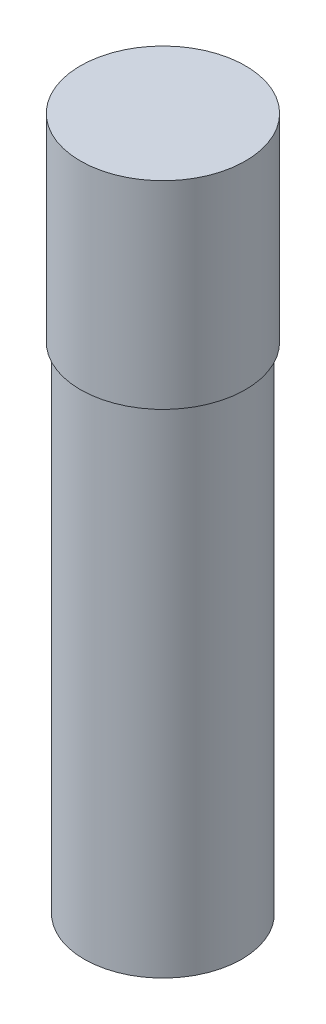
ISO-10303-21;
HEADER;
FILE_DESCRIPTION(('STEP AP214'),'2;1');
FILE_NAME('part.step','',(''),(''),'','','');
FILE_SCHEMA(('AUTOMOTIVE_DESIGN { 1 0 10303 214 1 1 1 1 }'));
ENDSEC;
DATA;
#1=APPLICATION_CONTEXT('core data for automotive mechanical design processes');
#2=APPLICATION_PROTOCOL_DEFINITION('international standard','automotive_design',2000,#1);
#3=PRODUCT_CONTEXT('',#1,'mechanical');
#4=PRODUCT('Part','Part','',(#3));
#5=PRODUCT_RELATED_PRODUCT_CATEGORY('part','',(#4));
#6=PRODUCT_DEFINITION_FORMATION('','',#4);
#7=PRODUCT_DEFINITION_CONTEXT('part definition',#1,'design');
#8=PRODUCT_DEFINITION('design','',#6,#7);
#9=PRODUCT_DEFINITION_SHAPE('','',#8);
#10=(LENGTH_UNIT() NAMED_UNIT(*) SI_UNIT(.MILLI.,.METRE.));
#11=(NAMED_UNIT(*) PLANE_ANGLE_UNIT() SI_UNIT($,.RADIAN.));
#12=(NAMED_UNIT(*) SI_UNIT($,.STERADIAN.) SOLID_ANGLE_UNIT());
#13=UNCERTAINTY_MEASURE_WITH_UNIT(LENGTH_MEASURE(1.E-05),#10,'distance_accuracy_value','');
#14=(GEOMETRIC_REPRESENTATION_CONTEXT(3) GLOBAL_UNCERTAINTY_ASSIGNED_CONTEXT((#13)) GLOBAL_UNIT_ASSIGNED_CONTEXT((#10,
#11,#12)) REPRESENTATION_CONTEXT('',''));
#15=CARTESIAN_POINT('',(0.,0.,0.));
#16=DIRECTION('',(0.,0.,1.));
#17=DIRECTION('',(1.,0.,0.));
#18=AXIS2_PLACEMENT_3D('',#15,#16,#17);
#19=CARTESIAN_POINT('',(0.,30.,0.));
#20=DIRECTION('',(0.,-1.,0.));
#21=DIRECTION('',(0.,0.,-1.));
#22=AXIS2_PLACEMENT_3D('',#19,#20,#21);
#23=CYLINDRICAL_SURFACE('',#22,4.775);
#24=CARTESIAN_POINT('',(0.,30.,0.));
#25=DIRECTION('',(0.,1.,0.));
#26=DIRECTION('',(0.,0.,1.));
#27=AXIS2_PLACEMENT_3D('',#24,#25,#26);
#28=CIRCLE('',#27,4.775);
#29=CARTESIAN_POINT('',(0.,30.,4.775));
#30=VERTEX_POINT('',#29);
#31=EDGE_CURVE('E10',#30,#30,#28,.T.);
#32=ORIENTED_EDGE('',*,*,#31,.F.);
#33=EDGE_LOOP('',(#32));
#34=FACE_BOUND('',#33,.T.);
#35=CARTESIAN_POINT('',(0.,0.,0.));
#36=DIRECTION('',(0.,1.,0.));
#37=DIRECTION('',(0.,0.,1.));
#38=AXIS2_PLACEMENT_3D('',#35,#36,#37);
#39=CIRCLE('',#38,4.775);
#40=CARTESIAN_POINT('',(0.,0.,4.775));
#41=VERTEX_POINT('',#40);
#42=EDGE_CURVE('E40',#41,#41,#39,.T.);
#43=ORIENTED_EDGE('',*,*,#42,.T.);
#44=EDGE_LOOP('',(#43));
#45=FACE_BOUND('',#44,.T.);
#46=ADVANCED_FACE('F37',(#34,#45),#23,.T.);
#47=CARTESIAN_POINT('',(0.,0.,0.));
#48=DIRECTION('',(0.,1.,0.));
#49=DIRECTION('',(0.,0.,1.));
#50=AXIS2_PLACEMENT_3D('',#47,#48,#49);
#51=PLANE('',#50);
#52=ORIENTED_EDGE('',*,*,#42,.F.);
#53=EDGE_LOOP('',(#52));
#54=FACE_BOUND('',#53,.T.);
#55=ADVANCED_FACE('F64',(#54),#51,.F.);
#56=CARTESIAN_POINT('',(0.,42.,0.));
#57=DIRECTION('',(0.,-1.,0.));
#58=DIRECTION('',(0.,0.,-1.));
#59=AXIS2_PLACEMENT_3D('',#56,#57,#58);
#60=CYLINDRICAL_SURFACE('',#59,5.);
#61=CARTESIAN_POINT('',(0.,42.,0.));
#62=DIRECTION('',(0.,1.,0.));
#63=DIRECTION('',(0.,0.,1.));
#64=AXIS2_PLACEMENT_3D('',#61,#62,#63);
#65=CIRCLE('',#64,5.);
#66=CARTESIAN_POINT('',(0.,42.,5.));
#67=VERTEX_POINT('',#66);
#68=EDGE_CURVE('E49',#67,#67,#65,.T.);
#69=ORIENTED_EDGE('',*,*,#68,.F.);
#70=EDGE_LOOP('',(#69));
#71=FACE_BOUND('',#70,.T.);
#72=CARTESIAN_POINT('',(0.,30.,0.));
#73=DIRECTION('',(0.,1.,0.));
#74=DIRECTION('',(0.,0.,1.));
#75=AXIS2_PLACEMENT_3D('',#72,#73,#74);
#76=CIRCLE('',#75,5.);
#77=CARTESIAN_POINT('',(0.,30.,5.));
#78=VERTEX_POINT('',#77);
#79=EDGE_CURVE('E51',#78,#78,#76,.T.);
#80=ORIENTED_EDGE('',*,*,#79,.T.);
#81=EDGE_LOOP('',(#80));
#82=FACE_BOUND('',#81,.T.);
#83=ADVANCED_FACE('F61',(#71,#82),#60,.T.);
#84=CARTESIAN_POINT('',(0.,42.,0.));
#85=DIRECTION('',(0.,1.,0.));
#86=DIRECTION('',(0.,0.,1.));
#87=AXIS2_PLACEMENT_3D('',#84,#85,#86);
#88=PLANE('',#87);
#89=ORIENTED_EDGE('',*,*,#68,.T.);
#90=EDGE_LOOP('',(#89));
#91=FACE_BOUND('',#90,.T.);
#92=ADVANCED_FACE('F59',(#91),#88,.T.);
#93=CARTESIAN_POINT('',(0.,30.,0.));
#94=DIRECTION('',(0.,1.,0.));
#95=DIRECTION('',(0.,0.,1.));
#96=AXIS2_PLACEMENT_3D('',#93,#94,#95);
#97=PLANE('',#96);
#98=ORIENTED_EDGE('',*,*,#31,.T.);
#99=EDGE_LOOP('',(#98));
#100=FACE_BOUND('',#99,.T.);
#101=ORIENTED_EDGE('',*,*,#79,.F.);
#102=EDGE_LOOP('',(#101));
#103=FACE_BOUND('',#102,.T.);
#104=ADVANCED_FACE('F68',(#100,#103),#97,.F.);
#105=CLOSED_SHELL('',(#46,#55,#83,#92,#104));
#106=MANIFOLD_SOLID_BREP('B2',#105);
#107=ADVANCED_BREP_SHAPE_REPRESENTATION('',(#18,#106),#14);
#108=SHAPE_DEFINITION_REPRESENTATION(#9,#107);
ENDSEC;
END-ISO-10303-21;
